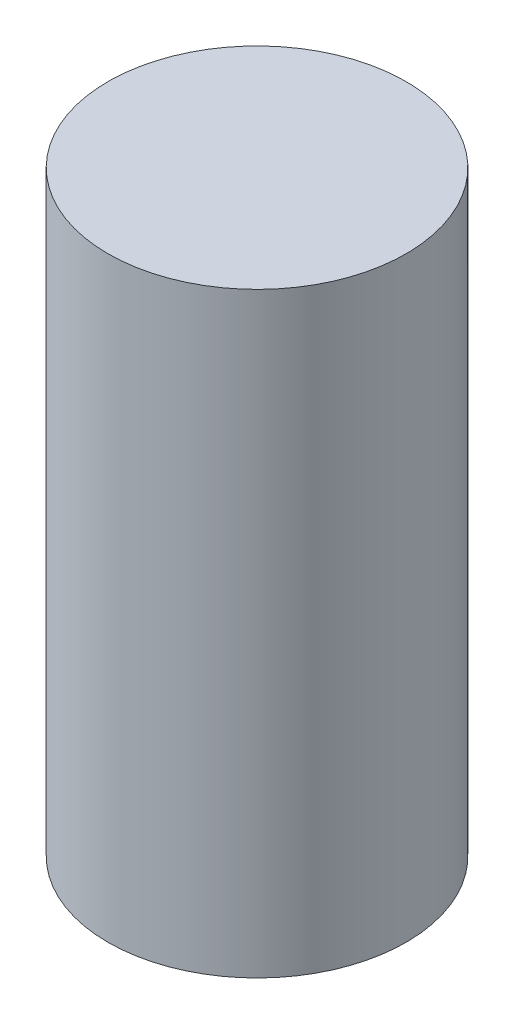
ISO-10303-21;
HEADER;
FILE_DESCRIPTION(('STEP AP214'),'2;1');
FILE_NAME('part.step','',(''),(''),'','','');
FILE_SCHEMA(('AUTOMOTIVE_DESIGN { 1 0 10303 214 1 1 1 1 }'));
ENDSEC;
DATA;
#1=APPLICATION_CONTEXT('core data for automotive mechanical design processes');
#2=APPLICATION_PROTOCOL_DEFINITION('international standard','automotive_design',2000,#1);
#3=PRODUCT_CONTEXT('',#1,'mechanical');
#4=PRODUCT('Part','Part','',(#3));
#5=PRODUCT_RELATED_PRODUCT_CATEGORY('part','',(#4));
#6=PRODUCT_DEFINITION_FORMATION('','',#4);
#7=PRODUCT_DEFINITION_CONTEXT('part definition',#1,'design');
#8=PRODUCT_DEFINITION('design','',#6,#7);
#9=PRODUCT_DEFINITION_SHAPE('','',#8);
#10=(LENGTH_UNIT() NAMED_UNIT(*) SI_UNIT(.MILLI.,.METRE.));
#11=(NAMED_UNIT(*) PLANE_ANGLE_UNIT() SI_UNIT($,.RADIAN.));
#12=(NAMED_UNIT(*) SI_UNIT($,.STERADIAN.) SOLID_ANGLE_UNIT());
#13=UNCERTAINTY_MEASURE_WITH_UNIT(LENGTH_MEASURE(1.E-05),#10,'distance_accuracy_value','');
#14=(GEOMETRIC_REPRESENTATION_CONTEXT(3) GLOBAL_UNCERTAINTY_ASSIGNED_CONTEXT((#13)) GLOBAL_UNIT_ASSIGNED_CONTEXT((#10,
#11,#12)) REPRESENTATION_CONTEXT('',''));
#15=CARTESIAN_POINT('',(0.,0.,0.));
#16=DIRECTION('',(0.,0.,1.));
#17=DIRECTION('',(1.,0.,0.));
#18=AXIS2_PLACEMENT_3D('',#15,#16,#17);
#19=CARTESIAN_POINT('',(0.,60.,0.));
#20=DIRECTION('',(0.,-1.,0.));
#21=DIRECTION('',(0.,0.,-1.));
#22=AXIS2_PLACEMENT_3D('',#19,#20,#21);
#23=CYLINDRICAL_SURFACE('',#22,15.);
#24=CARTESIAN_POINT('',(0.,60.,0.));
#25=DIRECTION('',(0.,1.,0.));
#26=DIRECTION('',(0.,0.,1.));
#27=AXIS2_PLACEMENT_3D('',#24,#25,#26);
#28=CIRCLE('',#27,15.);
#29=CARTESIAN_POINT('',(0.,60.,15.));
#30=VERTEX_POINT('',#29);
#31=EDGE_CURVE('E10',#30,#30,#28,.T.);
#32=ORIENTED_EDGE('',*,*,#31,.F.);
#33=EDGE_LOOP('',(#32));
#34=FACE_BOUND('',#33,.T.);
#35=CARTESIAN_POINT('',(0.,0.,0.));
#36=DIRECTION('',(0.,1.,0.));
#37=DIRECTION('',(0.,0.,1.));
#38=AXIS2_PLACEMENT_3D('',#35,#36,#37);
#39=CIRCLE('',#38,15.);
#40=CARTESIAN_POINT('',(0.,0.,15.));
#41=VERTEX_POINT('',#40);
#42=EDGE_CURVE('E41',#41,#41,#39,.T.);
#43=ORIENTED_EDGE('',*,*,#42,.T.);
#44=EDGE_LOOP('',(#43));
#45=FACE_BOUND('',#44,.T.);
#46=ADVANCED_FACE('F38',(#34,#45),#23,.T.);
#47=CARTESIAN_POINT('',(0.,60.,0.));
#48=DIRECTION('',(0.,1.,0.));
#49=DIRECTION('',(0.,0.,1.));
#50=AXIS2_PLACEMENT_3D('',#47,#48,#49);
#51=PLANE('',#50);
#52=ORIENTED_EDGE('',*,*,#31,.T.);
#53=EDGE_LOOP('',(#52));
#54=FACE_BOUND('',#53,.T.);
#55=ADVANCED_FACE('F55',(#54),#51,.T.);
#56=CARTESIAN_POINT('',(0.,0.,0.));
#57=DIRECTION('',(0.,1.,0.));
#58=DIRECTION('',(0.,0.,1.));
#59=AXIS2_PLACEMENT_3D('',#56,#57,#58);
#60=PLANE('',#59);
#61=ORIENTED_EDGE('',*,*,#42,.F.);
#62=EDGE_LOOP('',(#61));
#63=FACE_BOUND('',#62,.T.);
#64=ADVANCED_FACE('F53',(#63),#60,.F.);
#65=CLOSED_SHELL('',(#46,#55,#64));
#66=MANIFOLD_SOLID_BREP('B2',#65);
#67=ADVANCED_BREP_SHAPE_REPRESENTATION('',(#18,#66),#14);
#68=SHAPE_DEFINITION_REPRESENTATION(#9,#67);
ENDSEC;
END-ISO-10303-21;
